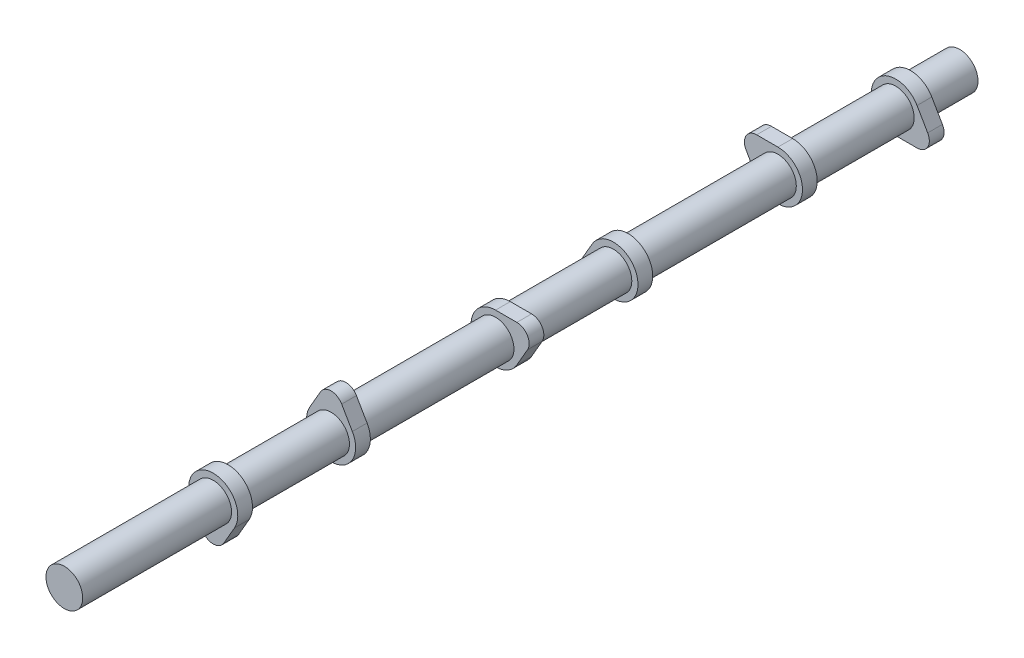
ISO-10303-21;
HEADER;
FILE_DESCRIPTION(('STEP AP214'),'2;1');
FILE_NAME('part.step','',(''),(''),'','','');
FILE_SCHEMA(('AUTOMOTIVE_DESIGN { 1 0 10303 214 1 1 1 1 }'));
ENDSEC;
DATA;
#1=APPLICATION_CONTEXT('core data for automotive mechanical design processes');
#2=APPLICATION_PROTOCOL_DEFINITION('international standard','automotive_design',2000,#1);
#3=PRODUCT_CONTEXT('',#1,'mechanical');
#4=PRODUCT('Part','Part','',(#3));
#5=PRODUCT_RELATED_PRODUCT_CATEGORY('part','',(#4));
#6=PRODUCT_DEFINITION_FORMATION('','',#4);
#7=PRODUCT_DEFINITION_CONTEXT('part definition',#1,'design');
#8=PRODUCT_DEFINITION('design','',#6,#7);
#9=PRODUCT_DEFINITION_SHAPE('','',#8);
#10=(LENGTH_UNIT() NAMED_UNIT(*) SI_UNIT(.MILLI.,.METRE.));
#11=(NAMED_UNIT(*) PLANE_ANGLE_UNIT() SI_UNIT($,.RADIAN.));
#12=(NAMED_UNIT(*) SI_UNIT($,.STERADIAN.) SOLID_ANGLE_UNIT());
#13=UNCERTAINTY_MEASURE_WITH_UNIT(LENGTH_MEASURE(1.E-05),#10,'distance_accuracy_value','');
#14=(GEOMETRIC_REPRESENTATION_CONTEXT(3) GLOBAL_UNCERTAINTY_ASSIGNED_CONTEXT((#13)) GLOBAL_UNIT_ASSIGNED_CONTEXT((#10,
#11,#12)) REPRESENTATION_CONTEXT('',''));
#15=CARTESIAN_POINT('',(0.,0.,0.));
#16=DIRECTION('',(0.,0.,1.));
#17=DIRECTION('',(1.,0.,0.));
#18=AXIS2_PLACEMENT_3D('',#15,#16,#17);
#19=CARTESIAN_POINT('',(0.,-12.7,68.58));
#20=DIRECTION('',(0.,0.,-1.));
#21=DIRECTION('',(1.,0.,0.));
#22=AXIS2_PLACEMENT_3D('',#19,#20,#21);
#23=CYLINDRICAL_SURFACE('',#22,6.35);
#24=CARTESIAN_POINT('',(0.,-12.7,60.96));
#25=DIRECTION('',(0.,0.,1.));
#26=DIRECTION('',(-1.,0.,0.));
#27=AXIS2_PLACEMENT_3D('',#24,#25,#26);
#28=CIRCLE('',#27,6.35);
#29=CARTESIAN_POINT('',(-5.4992613140313,-15.875,60.96));
#30=VERTEX_POINT('',#29);
#31=CARTESIAN_POINT('',(5.49926131403108,-15.875,60.96));
#32=VERTEX_POINT('',#31);
#33=EDGE_CURVE('E464',#30,#32,#28,.T.);
#34=ORIENTED_EDGE('',*,*,#33,.T.);
#35=DIRECTION('',(0.,0.,-1.));
#36=VECTOR('',#35,1.);
#37=CARTESIAN_POINT('',(5.49926131403108,-15.875,68.58));
#38=LINE('',#37,#36);
#39=CARTESIAN_POINT('',(5.49926131403108,-15.875,68.58));
#40=VERTEX_POINT('',#39);
#41=EDGE_CURVE('E494',#40,#32,#38,.T.);
#42=ORIENTED_EDGE('',*,*,#41,.F.);
#43=CARTESIAN_POINT('',(0.,-12.7,68.58));
#44=DIRECTION('',(0.,0.,1.));
#45=DIRECTION('',(-1.,0.,0.));
#46=AXIS2_PLACEMENT_3D('',#43,#44,#45);
#47=CIRCLE('',#46,6.35);
#48=CARTESIAN_POINT('',(-5.4992613140313,-15.875,68.58));
#49=VERTEX_POINT('',#48);
#50=EDGE_CURVE('E465',#49,#40,#47,.T.);
#51=ORIENTED_EDGE('',*,*,#50,.F.);
#52=DIRECTION('',(0.,0.,-1.));
#53=VECTOR('',#52,1.);
#54=CARTESIAN_POINT('',(-5.4992613140313,-15.875,68.58));
#55=LINE('',#54,#53);
#56=EDGE_CURVE('E475',#49,#30,#55,.T.);
#57=ORIENTED_EDGE('',*,*,#56,.T.);
#58=EDGE_LOOP('',(#34,#42,#51,#57));
#59=FACE_BOUND('',#58,.T.);
#60=ADVANCED_FACE('F45',(#59),#23,.T.);
#61=CARTESIAN_POINT('',(5.49926131403108,-15.875,68.58));
#62=DIRECTION('',(-0.866025403784435,0.500000000000006,0.));
#63=DIRECTION('',(-0.500000000000006,-0.866025403784435,0.));
#64=AXIS2_PLACEMENT_3D('',#61,#62,#63);
#65=PLANE('',#64);
#66=DIRECTION('',(0.500000000000006,0.866025403784435,0.));
#67=VECTOR('',#66,1.);
#68=CARTESIAN_POINT('',(5.49926131403108,-15.875,60.96));
#69=LINE('',#68,#67);
#70=CARTESIAN_POINT('',(10.9985226280623,-6.35000000000007,60.96));
#71=VERTEX_POINT('',#70);
#72=EDGE_CURVE('E479',#32,#71,#69,.T.);
#73=ORIENTED_EDGE('',*,*,#72,.T.);
#74=DIRECTION('',(0.,0.,-1.));
#75=VECTOR('',#74,1.);
#76=CARTESIAN_POINT('',(10.9985226280623,-6.35000000000007,68.58));
#77=LINE('',#76,#75);
#78=CARTESIAN_POINT('',(10.9985226280623,-6.35000000000007,68.58));
#79=VERTEX_POINT('',#78);
#80=EDGE_CURVE('E491',#79,#71,#77,.T.);
#81=ORIENTED_EDGE('',*,*,#80,.F.);
#82=DIRECTION('',(0.500000000000006,0.866025403784435,0.));
#83=VECTOR('',#82,1.);
#84=CARTESIAN_POINT('',(5.49926131403108,-15.875,68.58));
#85=LINE('',#84,#83);
#86=EDGE_CURVE('E95',#40,#79,#85,.T.);
#87=ORIENTED_EDGE('',*,*,#86,.F.);
#88=ORIENTED_EDGE('',*,*,#41,.T.);
#89=EDGE_LOOP('',(#73,#81,#87,#88));
#90=FACE_BOUND('',#89,.T.);
#91=ADVANCED_FACE('F515',(#90),#65,.F.);
#92=CARTESIAN_POINT('',(0.,0.,68.58));
#93=DIRECTION('',(0.,0.,-1.));
#94=DIRECTION('',(1.,0.,0.));
#95=AXIS2_PLACEMENT_3D('',#92,#93,#94);
#96=CYLINDRICAL_SURFACE('',#95,12.7);
#97=CARTESIAN_POINT('',(0.,0.,60.96));
#98=DIRECTION('',(0.,0.,1.));
#99=DIRECTION('',(-1.,0.,0.));
#100=AXIS2_PLACEMENT_3D('',#97,#98,#99);
#101=CIRCLE('',#100,12.7);
#102=CARTESIAN_POINT('',(-10.9985226280624,-6.34999999999993,60.96));
#103=VERTEX_POINT('',#102);
#104=EDGE_CURVE('E81',#71,#103,#101,.T.);
#105=ORIENTED_EDGE('',*,*,#104,.T.);
#106=DIRECTION('',(0.,0.,-1.));
#107=VECTOR('',#106,1.);
#108=CARTESIAN_POINT('',(-10.9985226280624,-6.34999999999993,68.58));
#109=LINE('',#108,#107);
#110=CARTESIAN_POINT('',(-10.9985226280624,-6.34999999999993,68.58));
#111=VERTEX_POINT('',#110);
#112=EDGE_CURVE('E488',#111,#103,#109,.T.);
#113=ORIENTED_EDGE('',*,*,#112,.F.);
#114=CARTESIAN_POINT('',(0.,0.,68.58));
#115=DIRECTION('',(0.,0.,1.));
#116=DIRECTION('',(-1.,0.,0.));
#117=AXIS2_PLACEMENT_3D('',#114,#115,#116);
#118=CIRCLE('',#117,12.7);
#119=EDGE_CURVE('E470',#79,#111,#118,.T.);
#120=ORIENTED_EDGE('',*,*,#119,.F.);
#121=ORIENTED_EDGE('',*,*,#80,.T.);
#122=EDGE_LOOP('',(#105,#113,#120,#121));
#123=FACE_BOUND('',#122,.T.);
#124=ADVANCED_FACE('F514',(#123),#96,.T.);
#125=CARTESIAN_POINT('',(-5.4992613140313,-15.875,68.58));
#126=DIRECTION('',(0.866025403784442,0.499999999999994,0.));
#127=DIRECTION('',(-0.499999999999994,0.866025403784442,0.));
#128=AXIS2_PLACEMENT_3D('',#125,#126,#127);
#129=PLANE('',#128);
#130=DIRECTION('',(0.499999999999994,-0.866025403784442,0.));
#131=VECTOR('',#130,1.);
#132=CARTESIAN_POINT('',(-5.4992613140313,-15.875,60.96));
#133=LINE('',#132,#131);
#134=EDGE_CURVE('E87',#103,#30,#133,.T.);
#135=ORIENTED_EDGE('',*,*,#134,.T.);
#136=ORIENTED_EDGE('',*,*,#56,.F.);
#137=DIRECTION('',(0.499999999999994,-0.866025403784442,0.));
#138=VECTOR('',#137,1.);
#139=CARTESIAN_POINT('',(-5.4992613140313,-15.875,68.58));
#140=LINE('',#139,#138);
#141=EDGE_CURVE('E63',#111,#49,#140,.T.);
#142=ORIENTED_EDGE('',*,*,#141,.F.);
#143=ORIENTED_EDGE('',*,*,#112,.T.);
#144=EDGE_LOOP('',(#135,#136,#142,#143));
#145=FACE_BOUND('',#144,.T.);
#146=ADVANCED_FACE('F512',(#145),#129,.F.);
#147=CARTESIAN_POINT('',(0.,-12.7,68.58));
#148=DIRECTION('',(0.,0.,1.));
#149=DIRECTION('',(-1.,0.,0.));
#150=AXIS2_PLACEMENT_3D('',#147,#148,#149);
#151=PLANE('',#150);
#152=CARTESIAN_POINT('',(0.,0.,68.58));
#153=DIRECTION('',(0.,0.,1.));
#154=DIRECTION('',(1.,0.,0.));
#155=AXIS2_PLACEMENT_3D('',#152,#153,#154);
#156=CIRCLE('',#155,9.5);
#157=CARTESIAN_POINT('',(9.5,0.,68.58));
#158=VERTEX_POINT('',#157);
#159=EDGE_CURVE('E460',#158,#158,#156,.F.);
#160=ORIENTED_EDGE('',*,*,#159,.T.);
#161=EDGE_LOOP('',(#160));
#162=FACE_BOUND('',#161,.T.);
#163=ORIENTED_EDGE('',*,*,#50,.T.);
#164=ORIENTED_EDGE('',*,*,#86,.T.);
#165=ORIENTED_EDGE('',*,*,#119,.T.);
#166=ORIENTED_EDGE('',*,*,#141,.T.);
#167=EDGE_LOOP('',(#163,#164,#165,#166));
#168=FACE_BOUND('',#167,.T.);
#169=ADVANCED_FACE('F506',(#162,#168),#151,.T.);
#170=CARTESIAN_POINT('',(0.,-12.7,60.96));
#171=DIRECTION('',(0.,0.,1.));
#172=DIRECTION('',(-1.,0.,0.));
#173=AXIS2_PLACEMENT_3D('',#170,#171,#172);
#174=PLANE('',#173);
#175=CARTESIAN_POINT('',(0.,0.,60.96));
#176=DIRECTION('',(0.,0.,1.));
#177=DIRECTION('',(1.,0.,0.));
#178=AXIS2_PLACEMENT_3D('',#175,#176,#177);
#179=CIRCLE('',#178,9.5);
#180=CARTESIAN_POINT('',(9.5,0.,60.96));
#181=VERTEX_POINT('',#180);
#182=EDGE_CURVE('E55',#181,#181,#179,.F.);
#183=ORIENTED_EDGE('',*,*,#182,.F.);
#184=EDGE_LOOP('',(#183));
#185=FACE_BOUND('',#184,.T.);
#186=ORIENTED_EDGE('',*,*,#33,.F.);
#187=ORIENTED_EDGE('',*,*,#134,.F.);
#188=ORIENTED_EDGE('',*,*,#104,.F.);
#189=ORIENTED_EDGE('',*,*,#72,.F.);
#190=EDGE_LOOP('',(#186,#187,#188,#189));
#191=FACE_BOUND('',#190,.T.);
#192=ADVANCED_FACE('F503',(#185,#191),#174,.F.);
#193=CARTESIAN_POINT('',(0.,0.,120.65));
#194=DIRECTION('',(0.,0.,-1.));
#195=DIRECTION('',(-1.,0.,0.));
#196=AXIS2_PLACEMENT_3D('',#193,#194,#195);
#197=CYLINDRICAL_SURFACE('',#196,9.5);
#198=CARTESIAN_POINT('',(0.,0.,7.62));
#199=DIRECTION('',(0.,0.,1.));
#200=DIRECTION('',(1.,0.,0.));
#201=AXIS2_PLACEMENT_3D('',#198,#199,#200);
#202=CIRCLE('',#201,9.5);
#203=CARTESIAN_POINT('',(9.5,0.,7.62));
#204=VERTEX_POINT('',#203);
#205=EDGE_CURVE('E48',#204,#204,#202,.T.);
#206=ORIENTED_EDGE('',*,*,#205,.T.);
#207=EDGE_LOOP('',(#206));
#208=FACE_BOUND('',#207,.T.);
#209=ORIENTED_EDGE('',*,*,#182,.T.);
#210=EDGE_LOOP('',(#209));
#211=FACE_BOUND('',#210,.T.);
#212=ADVANCED_FACE('F501',(#208,#211),#197,.T.);
#213=ORIENTED_EDGE('',*,*,#159,.F.);
#214=EDGE_LOOP('',(#213));
#215=FACE_BOUND('',#214,.T.);
#216=CARTESIAN_POINT('',(0.,0.,145.59));
#217=DIRECTION('',(0.,0.,1.));
#218=DIRECTION('',(1.,0.,0.));
#219=AXIS2_PLACEMENT_3D('',#216,#217,#218);
#220=CIRCLE('',#219,9.5);
#221=CARTESIAN_POINT('',(9.5,0.,145.59));
#222=VERTEX_POINT('',#221);
#223=EDGE_CURVE('E411',#222,#222,#220,.T.);
#224=ORIENTED_EDGE('',*,*,#223,.F.);
#225=EDGE_LOOP('',(#224));
#226=FACE_BOUND('',#225,.T.);
#227=ADVANCED_FACE('F528',(#215,#226),#197,.T.);
#228=CARTESIAN_POINT('',(0.,12.7,7.62));
#229=DIRECTION('',(0.,0.,-1.));
#230=DIRECTION('',(-1.,0.,0.));
#231=AXIS2_PLACEMENT_3D('',#228,#229,#230);
#232=CYLINDRICAL_SURFACE('',#231,6.35);
#233=CARTESIAN_POINT('',(0.,12.7,0.));
#234=DIRECTION('',(0.,0.,1.));
#235=DIRECTION('',(1.,0.,0.));
#236=AXIS2_PLACEMENT_3D('',#233,#234,#235);
#237=CIRCLE('',#236,6.35);
#238=CARTESIAN_POINT('',(5.49926131403119,15.875,0.));
#239=VERTEX_POINT('',#238);
#240=CARTESIAN_POINT('',(-5.49926131403119,15.875,0.));
#241=VERTEX_POINT('',#240);
#242=EDGE_CURVE('E418',#239,#241,#237,.T.);
#243=ORIENTED_EDGE('',*,*,#242,.T.);
#244=DIRECTION('',(0.,0.,-1.));
#245=VECTOR('',#244,1.);
#246=CARTESIAN_POINT('',(-5.49926131403119,15.875,7.62));
#247=LINE('',#246,#245);
#248=CARTESIAN_POINT('',(-5.49926131403119,15.875,7.62));
#249=VERTEX_POINT('',#248);
#250=EDGE_CURVE('E456',#249,#241,#247,.T.);
#251=ORIENTED_EDGE('',*,*,#250,.F.);
#252=CARTESIAN_POINT('',(0.,12.7,7.62));
#253=DIRECTION('',(0.,0.,1.));
#254=DIRECTION('',(1.,0.,0.));
#255=AXIS2_PLACEMENT_3D('',#252,#253,#254);
#256=CIRCLE('',#255,6.35);
#257=CARTESIAN_POINT('',(5.49926131403119,15.875,7.62));
#258=VERTEX_POINT('',#257);
#259=EDGE_CURVE('E419',#258,#249,#256,.T.);
#260=ORIENTED_EDGE('',*,*,#259,.F.);
#261=DIRECTION('',(0.,0.,-1.));
#262=VECTOR('',#261,1.);
#263=CARTESIAN_POINT('',(5.49926131403119,15.875,7.62));
#264=LINE('',#263,#262);
#265=EDGE_CURVE('E433',#258,#239,#264,.T.);
#266=ORIENTED_EDGE('',*,*,#265,.T.);
#267=EDGE_LOOP('',(#243,#251,#260,#266));
#268=FACE_BOUND('',#267,.T.);
#269=ADVANCED_FACE('F531',(#268),#232,.T.);
#270=CARTESIAN_POINT('',(-5.49926131403119,15.875,7.62));
#271=DIRECTION('',(0.866025403784439,-0.5,0.));
#272=DIRECTION('',(0.5,0.866025403784439,0.));
#273=AXIS2_PLACEMENT_3D('',#270,#271,#272);
#274=PLANE('',#273);
#275=DIRECTION('',(-0.5,-0.866025403784439,0.));
#276=VECTOR('',#275,1.);
#277=CARTESIAN_POINT('',(-5.49926131403119,15.875,0.));
#278=LINE('',#277,#276);
#279=CARTESIAN_POINT('',(-10.9985226280624,6.35,0.));
#280=VERTEX_POINT('',#279);
#281=EDGE_CURVE('E437',#241,#280,#278,.T.);
#282=ORIENTED_EDGE('',*,*,#281,.T.);
#283=DIRECTION('',(0.,0.,-1.));
#284=VECTOR('',#283,1.);
#285=CARTESIAN_POINT('',(-10.9985226280624,6.35,7.62));
#286=LINE('',#285,#284);
#287=CARTESIAN_POINT('',(-10.9985226280624,6.35,7.62));
#288=VERTEX_POINT('',#287);
#289=EDGE_CURVE('E452',#288,#280,#286,.T.);
#290=ORIENTED_EDGE('',*,*,#289,.F.);
#291=DIRECTION('',(-0.5,-0.866025403784439,0.));
#292=VECTOR('',#291,1.);
#293=CARTESIAN_POINT('',(-5.49926131403119,15.875,7.62));
#294=LINE('',#293,#292);
#295=EDGE_CURVE('E423',#249,#288,#294,.T.);
#296=ORIENTED_EDGE('',*,*,#295,.F.);
#297=ORIENTED_EDGE('',*,*,#250,.T.);
#298=EDGE_LOOP('',(#282,#290,#296,#297));
#299=FACE_BOUND('',#298,.T.);
#300=ADVANCED_FACE('F536',(#299),#274,.F.);
#301=CARTESIAN_POINT('',(0.,0.,7.62));
#302=DIRECTION('',(0.,0.,-1.));
#303=DIRECTION('',(-1.,0.,0.));
#304=AXIS2_PLACEMENT_3D('',#301,#302,#303);
#305=CYLINDRICAL_SURFACE('',#304,12.7);
#306=CARTESIAN_POINT('',(0.,0.,0.));
#307=DIRECTION('',(0.,0.,1.));
#308=DIRECTION('',(1.,0.,0.));
#309=AXIS2_PLACEMENT_3D('',#306,#307,#308);
#310=CIRCLE('',#309,12.7);
#311=CARTESIAN_POINT('',(10.9985226280624,6.35,0.));
#312=VERTEX_POINT('',#311);
#313=EDGE_CURVE('E440',#280,#312,#310,.T.);
#314=ORIENTED_EDGE('',*,*,#313,.T.);
#315=DIRECTION('',(0.,0.,-1.));
#316=VECTOR('',#315,1.);
#317=CARTESIAN_POINT('',(10.9985226280624,6.35,7.62));
#318=LINE('',#317,#316);
#319=CARTESIAN_POINT('',(10.9985226280624,6.35,7.62));
#320=VERTEX_POINT('',#319);
#321=EDGE_CURVE('E448',#320,#312,#318,.T.);
#322=ORIENTED_EDGE('',*,*,#321,.F.);
#323=CARTESIAN_POINT('',(0.,0.,7.62));
#324=DIRECTION('',(0.,0.,1.));
#325=DIRECTION('',(1.,0.,0.));
#326=AXIS2_PLACEMENT_3D('',#323,#324,#325);
#327=CIRCLE('',#326,12.7);
#328=EDGE_CURVE('E427',#288,#320,#327,.T.);
#329=ORIENTED_EDGE('',*,*,#328,.F.);
#330=ORIENTED_EDGE('',*,*,#289,.T.);
#331=EDGE_LOOP('',(#314,#322,#329,#330));
#332=FACE_BOUND('',#331,.T.);
#333=ADVANCED_FACE('F540',(#332),#305,.T.);
#334=CARTESIAN_POINT('',(5.49926131403119,15.875,7.62));
#335=DIRECTION('',(-0.866025403784439,-0.5,0.));
#336=DIRECTION('',(0.5,-0.866025403784439,0.));
#337=AXIS2_PLACEMENT_3D('',#334,#335,#336);
#338=PLANE('',#337);
#339=DIRECTION('',(-0.5,0.866025403784439,0.));
#340=VECTOR('',#339,1.);
#341=CARTESIAN_POINT('',(5.49926131403119,15.875,0.));
#342=LINE('',#341,#340);
#343=EDGE_CURVE('E424',#312,#239,#342,.T.);
#344=ORIENTED_EDGE('',*,*,#343,.T.);
#345=ORIENTED_EDGE('',*,*,#265,.F.);
#346=DIRECTION('',(-0.5,0.866025403784439,0.));
#347=VECTOR('',#346,1.);
#348=CARTESIAN_POINT('',(5.49926131403119,15.875,7.62));
#349=LINE('',#348,#347);
#350=EDGE_CURVE('E430',#320,#258,#349,.T.);
#351=ORIENTED_EDGE('',*,*,#350,.F.);
#352=ORIENTED_EDGE('',*,*,#321,.T.);
#353=EDGE_LOOP('',(#344,#345,#351,#352));
#354=FACE_BOUND('',#353,.T.);
#355=ADVANCED_FACE('F544',(#354),#338,.F.);
#356=CARTESIAN_POINT('',(0.,12.7,7.62));
#357=DIRECTION('',(0.,0.,1.));
#358=DIRECTION('',(1.,0.,0.));
#359=AXIS2_PLACEMENT_3D('',#356,#357,#358);
#360=PLANE('',#359);
#361=ORIENTED_EDGE('',*,*,#205,.F.);
#362=EDGE_LOOP('',(#361));
#363=FACE_BOUND('',#362,.T.);
#364=ORIENTED_EDGE('',*,*,#259,.T.);
#365=ORIENTED_EDGE('',*,*,#295,.T.);
#366=ORIENTED_EDGE('',*,*,#328,.T.);
#367=ORIENTED_EDGE('',*,*,#350,.T.);
#368=EDGE_LOOP('',(#364,#365,#366,#367));
#369=FACE_BOUND('',#368,.T.);
#370=ADVANCED_FACE('F548',(#363,#369),#360,.T.);
#371=CARTESIAN_POINT('',(0.,12.7,0.));
#372=DIRECTION('',(0.,0.,1.));
#373=DIRECTION('',(1.,0.,0.));
#374=AXIS2_PLACEMENT_3D('',#371,#372,#373);
#375=PLANE('',#374);
#376=CARTESIAN_POINT('',(0.,0.,0.));
#377=DIRECTION('',(0.,0.,1.));
#378=DIRECTION('',(1.,0.,0.));
#379=AXIS2_PLACEMENT_3D('',#376,#377,#378);
#380=CIRCLE('',#379,9.5);
#381=CARTESIAN_POINT('',(9.5,0.,0.));
#382=VERTEX_POINT('',#381);
#383=EDGE_CURVE('E11',#382,#382,#380,.T.);
#384=ORIENTED_EDGE('',*,*,#383,.T.);
#385=EDGE_LOOP('',(#384));
#386=FACE_BOUND('',#385,.T.);
#387=ORIENTED_EDGE('',*,*,#242,.F.);
#388=ORIENTED_EDGE('',*,*,#343,.F.);
#389=ORIENTED_EDGE('',*,*,#313,.F.);
#390=ORIENTED_EDGE('',*,*,#281,.F.);
#391=EDGE_LOOP('',(#387,#388,#389,#390));
#392=FACE_BOUND('',#391,.T.);
#393=ADVANCED_FACE('F550',(#386,#392),#375,.F.);
#394=ORIENTED_EDGE('',*,*,#383,.F.);
#395=EDGE_LOOP('',(#394));
#396=FACE_BOUND('',#395,.T.);
#397=CARTESIAN_POINT('',(0.,0.,-77.47));
#398=DIRECTION('',(0.,0.,1.));
#399=DIRECTION('',(-0.500000000000004,0.866025403784436,0.));
#400=AXIS2_PLACEMENT_3D('',#397,#398,#399);
#401=CIRCLE('',#400,9.5);
#402=CARTESIAN_POINT('',(-4.75000000000004,8.22724133595215,-77.47));
#403=VERTEX_POINT('',#402);
#404=EDGE_CURVE('E357',#403,#403,#401,.F.);
#405=ORIENTED_EDGE('',*,*,#404,.F.);
#406=EDGE_LOOP('',(#405));
#407=FACE_BOUND('',#406,.T.);
#408=ADVANCED_FACE('F533',(#396,#407),#197,.T.);
#409=CARTESIAN_POINT('',(0.,0.,145.59));
#410=DIRECTION('',(0.,0.,1.));
#411=DIRECTION('',(1.,0.,0.));
#412=AXIS2_PLACEMENT_3D('',#409,#410,#411);
#413=PLANE('',#412);
#414=ORIENTED_EDGE('',*,*,#223,.T.);
#415=EDGE_LOOP('',(#414));
#416=FACE_BOUND('',#415,.T.);
#417=ADVANCED_FACE('F557',(#416),#413,.T.);
#418=CARTESIAN_POINT('',(10.9985226280624,6.34999999999998,-77.47));
#419=DIRECTION('',(0.,0.,-1.));
#420=DIRECTION('',(-0.499999999999998,0.86602540378444,0.));
#421=AXIS2_PLACEMENT_3D('',#418,#419,#420);
#422=CYLINDRICAL_SURFACE('',#421,6.35);
#423=CARTESIAN_POINT('',(10.9985226280624,6.34999999999998,-85.09));
#424=DIRECTION('',(0.,0.,1.));
#425=DIRECTION('',(0.499999999999998,-0.86602540378444,0.));
#426=AXIS2_PLACEMENT_3D('',#423,#424,#425);
#427=CIRCLE('',#426,6.35);
#428=CARTESIAN_POINT('',(16.4977839420936,3.17499999999996,-85.09));
#429=VERTEX_POINT('',#428);
#430=CARTESIAN_POINT('',(10.9985226280624,12.7,-85.09));
#431=VERTEX_POINT('',#430);
#432=EDGE_CURVE('E361',#429,#431,#427,.T.);
#433=ORIENTED_EDGE('',*,*,#432,.T.);
#434=DIRECTION('',(0.,0.,-1.));
#435=VECTOR('',#434,1.);
#436=CARTESIAN_POINT('',(10.9985226280624,12.7,-77.47));
#437=LINE('',#436,#435);
#438=CARTESIAN_POINT('',(10.9985226280624,12.7,-77.47));
#439=VERTEX_POINT('',#438);
#440=EDGE_CURVE('E399',#439,#431,#437,.T.);
#441=ORIENTED_EDGE('',*,*,#440,.F.);
#442=CARTESIAN_POINT('',(10.9985226280624,6.34999999999998,-77.47));
#443=DIRECTION('',(0.,0.,1.));
#444=DIRECTION('',(0.499999999999998,-0.86602540378444,0.));
#445=AXIS2_PLACEMENT_3D('',#442,#443,#444);
#446=CIRCLE('',#445,6.35);
#447=CARTESIAN_POINT('',(16.4977839420936,3.17499999999996,-77.47));
#448=VERTEX_POINT('',#447);
#449=EDGE_CURVE('E362',#448,#439,#446,.T.);
#450=ORIENTED_EDGE('',*,*,#449,.F.);
#451=DIRECTION('',(0.,0.,-1.));
#452=VECTOR('',#451,1.);
#453=CARTESIAN_POINT('',(16.4977839420936,3.17499999999996,-77.47));
#454=LINE('',#453,#452);
#455=EDGE_CURVE('E376',#448,#429,#454,.T.);
#456=ORIENTED_EDGE('',*,*,#455,.T.);
#457=EDGE_LOOP('',(#433,#441,#450,#456));
#458=FACE_BOUND('',#457,.T.);
#459=ADVANCED_FACE('F560',(#458),#422,.T.);
#460=CARTESIAN_POINT('',(10.9985226280624,12.7,-77.47));
#461=DIRECTION('',(0.,-1.,0.));
#462=DIRECTION('',(1.,0.,0.));
#463=AXIS2_PLACEMENT_3D('',#460,#461,#462);
#464=PLANE('',#463);
#465=DIRECTION('',(-1.,0.,0.));
#466=VECTOR('',#465,1.);
#467=CARTESIAN_POINT('',(10.9985226280624,12.7,-85.09));
#468=LINE('',#467,#466);
#469=CARTESIAN_POINT('',(0.,12.7,-85.09));
#470=VERTEX_POINT('',#469);
#471=EDGE_CURVE('E380',#431,#470,#468,.T.);
#472=ORIENTED_EDGE('',*,*,#471,.T.);
#473=DIRECTION('',(0.,0.,-1.));
#474=VECTOR('',#473,1.);
#475=CARTESIAN_POINT('',(0.,12.7,-77.47));
#476=LINE('',#475,#474);
#477=CARTESIAN_POINT('',(0.,12.7,-77.47));
#478=VERTEX_POINT('',#477);
#479=EDGE_CURVE('E395',#478,#470,#476,.T.);
#480=ORIENTED_EDGE('',*,*,#479,.F.);
#481=DIRECTION('',(-1.,0.,0.));
#482=VECTOR('',#481,1.);
#483=CARTESIAN_POINT('',(10.9985226280624,12.7,-77.47));
#484=LINE('',#483,#482);
#485=EDGE_CURVE('E366',#439,#478,#484,.T.);
#486=ORIENTED_EDGE('',*,*,#485,.F.);
#487=ORIENTED_EDGE('',*,*,#440,.T.);
#488=EDGE_LOOP('',(#472,#480,#486,#487));
#489=FACE_BOUND('',#488,.T.);
#490=ADVANCED_FACE('F564',(#489),#464,.F.);
#491=CARTESIAN_POINT('',(0.,0.,-77.47));
#492=DIRECTION('',(0.,0.,-1.));
#493=DIRECTION('',(-0.499999999999998,0.86602540378444,0.));
#494=AXIS2_PLACEMENT_3D('',#491,#492,#493);
#495=CYLINDRICAL_SURFACE('',#494,12.7);
#496=CARTESIAN_POINT('',(0.,0.,-85.09));
#497=DIRECTION('',(0.,0.,1.));
#498=DIRECTION('',(0.499999999999998,-0.86602540378444,0.));
#499=AXIS2_PLACEMENT_3D('',#496,#497,#498);
#500=CIRCLE('',#499,12.7);
#501=CARTESIAN_POINT('',(10.9985226280624,-6.35000000000002,-85.09));
#502=VERTEX_POINT('',#501);
#503=EDGE_CURVE('E383',#470,#502,#500,.T.);
#504=ORIENTED_EDGE('',*,*,#503,.T.);
#505=DIRECTION('',(0.,0.,-1.));
#506=VECTOR('',#505,1.);
#507=CARTESIAN_POINT('',(10.9985226280624,-6.35000000000002,-77.47));
#508=LINE('',#507,#506);
#509=CARTESIAN_POINT('',(10.9985226280624,-6.35000000000002,-77.47));
#510=VERTEX_POINT('',#509);
#511=EDGE_CURVE('E391',#510,#502,#508,.T.);
#512=ORIENTED_EDGE('',*,*,#511,.F.);
#513=CARTESIAN_POINT('',(0.,0.,-77.47));
#514=DIRECTION('',(0.,0.,1.));
#515=DIRECTION('',(0.499999999999998,-0.86602540378444,0.));
#516=AXIS2_PLACEMENT_3D('',#513,#514,#515);
#517=CIRCLE('',#516,12.7);
#518=EDGE_CURVE('E370',#478,#510,#517,.T.);
#519=ORIENTED_EDGE('',*,*,#518,.F.);
#520=ORIENTED_EDGE('',*,*,#479,.T.);
#521=EDGE_LOOP('',(#504,#512,#519,#520));
#522=FACE_BOUND('',#521,.T.);
#523=ADVANCED_FACE('F568',(#522),#495,.T.);
#524=CARTESIAN_POINT('',(16.4977839420936,3.17499999999996,-77.47));
#525=DIRECTION('',(-0.866025403784437,0.500000000000002,0.));
#526=DIRECTION('',(-0.500000000000002,-0.866025403784437,0.));
#527=AXIS2_PLACEMENT_3D('',#524,#525,#526);
#528=PLANE('',#527);
#529=DIRECTION('',(0.500000000000002,0.866025403784437,0.));
#530=VECTOR('',#529,1.);
#531=CARTESIAN_POINT('',(16.4977839420936,3.17499999999996,-85.09));
#532=LINE('',#531,#530);
#533=EDGE_CURVE('E367',#502,#429,#532,.T.);
#534=ORIENTED_EDGE('',*,*,#533,.T.);
#535=ORIENTED_EDGE('',*,*,#455,.F.);
#536=DIRECTION('',(0.500000000000002,0.866025403784437,0.));
#537=VECTOR('',#536,1.);
#538=CARTESIAN_POINT('',(16.4977839420936,3.17499999999996,-77.47));
#539=LINE('',#538,#537);
#540=EDGE_CURVE('E373',#510,#448,#539,.T.);
#541=ORIENTED_EDGE('',*,*,#540,.F.);
#542=ORIENTED_EDGE('',*,*,#511,.T.);
#543=EDGE_LOOP('',(#534,#535,#541,#542));
#544=FACE_BOUND('',#543,.T.);
#545=ADVANCED_FACE('F572',(#544),#528,.F.);
#546=CARTESIAN_POINT('',(10.9985226280624,6.34999999999998,-77.47));
#547=DIRECTION('',(0.,0.,1.));
#548=DIRECTION('',(0.499999999999998,-0.86602540378444,0.));
#549=AXIS2_PLACEMENT_3D('',#546,#547,#548);
#550=PLANE('',#549);
#551=ORIENTED_EDGE('',*,*,#404,.T.);
#552=EDGE_LOOP('',(#551));
#553=FACE_BOUND('',#552,.T.);
#554=ORIENTED_EDGE('',*,*,#449,.T.);
#555=ORIENTED_EDGE('',*,*,#485,.T.);
#556=ORIENTED_EDGE('',*,*,#518,.T.);
#557=ORIENTED_EDGE('',*,*,#540,.T.);
#558=EDGE_LOOP('',(#554,#555,#556,#557));
#559=FACE_BOUND('',#558,.T.);
#560=ADVANCED_FACE('F576',(#553,#559),#550,.T.);
#561=CARTESIAN_POINT('',(10.9985226280624,6.34999999999998,-85.09));
#562=DIRECTION('',(0.,0.,1.));
#563=DIRECTION('',(0.499999999999998,-0.86602540378444,0.));
#564=AXIS2_PLACEMENT_3D('',#561,#562,#563);
#565=PLANE('',#564);
#566=CARTESIAN_POINT('',(0.,0.,-85.09));
#567=DIRECTION('',(0.,0.,1.));
#568=DIRECTION('',(-0.500000000000004,0.866025403784436,0.));
#569=AXIS2_PLACEMENT_3D('',#566,#567,#568);
#570=CIRCLE('',#569,9.5);
#571=CARTESIAN_POINT('',(-4.75000000000004,8.22724133595215,-85.09));
#572=VERTEX_POINT('',#571);
#573=EDGE_CURVE('E403',#572,#572,#570,.F.);
#574=ORIENTED_EDGE('',*,*,#573,.F.);
#575=EDGE_LOOP('',(#574));
#576=FACE_BOUND('',#575,.T.);
#577=ORIENTED_EDGE('',*,*,#432,.F.);
#578=ORIENTED_EDGE('',*,*,#533,.F.);
#579=ORIENTED_EDGE('',*,*,#503,.F.);
#580=ORIENTED_EDGE('',*,*,#471,.F.);
#581=EDGE_LOOP('',(#577,#578,#579,#580));
#582=FACE_BOUND('',#581,.T.);
#583=ADVANCED_FACE('F578',(#576,#582),#565,.F.);
#584=CARTESIAN_POINT('',(0.,0.,-25.4));
#585=DIRECTION('',(0.,0.,-1.));
#586=DIRECTION('',(0.500000000000004,-0.866025403784436,0.));
#587=AXIS2_PLACEMENT_3D('',#584,#585,#586);
#588=CYLINDRICAL_SURFACE('',#587,9.5);
#589=CARTESIAN_POINT('',(0.,0.,-138.43));
#590=DIRECTION('',(0.,0.,1.));
#591=DIRECTION('',(-0.500000000000004,0.866025403784436,0.));
#592=AXIS2_PLACEMENT_3D('',#589,#590,#591);
#593=CIRCLE('',#592,9.5);
#594=CARTESIAN_POINT('',(-4.75000000000004,8.22724133595215,-138.43));
#595=VERTEX_POINT('',#594);
#596=EDGE_CURVE('E356',#595,#595,#593,.T.);
#597=ORIENTED_EDGE('',*,*,#596,.T.);
#598=EDGE_LOOP('',(#597));
#599=FACE_BOUND('',#598,.T.);
#600=ORIENTED_EDGE('',*,*,#573,.T.);
#601=EDGE_LOOP('',(#600));
#602=FACE_BOUND('',#601,.T.);
#603=ADVANCED_FACE('F581',(#599,#602),#588,.T.);
#604=CARTESIAN_POINT('',(-10.9985226280623,-6.35000000000005,-138.43));
#605=DIRECTION('',(0.,0.,-1.));
#606=DIRECTION('',(0.500000000000004,-0.866025403784436,0.));
#607=AXIS2_PLACEMENT_3D('',#604,#605,#606);
#608=CYLINDRICAL_SURFACE('',#607,6.35);
#609=CARTESIAN_POINT('',(-10.9985226280623,-6.35000000000005,-146.05));
#610=DIRECTION('',(0.,0.,1.));
#611=DIRECTION('',(-0.500000000000004,0.866025403784436,0.));
#612=AXIS2_PLACEMENT_3D('',#609,#610,#611);
#613=CIRCLE('',#612,6.35);
#614=CARTESIAN_POINT('',(-16.4977839420935,-3.17500000000008,-146.05));
#615=VERTEX_POINT('',#614);
#616=CARTESIAN_POINT('',(-10.9985226280623,-12.7000000000001,-146.05));
#617=VERTEX_POINT('',#616);
#618=EDGE_CURVE('E313',#615,#617,#613,.T.);
#619=ORIENTED_EDGE('',*,*,#618,.T.);
#620=DIRECTION('',(0.,0.,-1.));
#621=VECTOR('',#620,1.);
#622=CARTESIAN_POINT('',(-10.9985226280623,-12.7000000000001,-138.43));
#623=LINE('',#622,#621);
#624=CARTESIAN_POINT('',(-10.9985226280623,-12.7000000000001,-138.43));
#625=VERTEX_POINT('',#624);
#626=EDGE_CURVE('E352',#625,#617,#623,.T.);
#627=ORIENTED_EDGE('',*,*,#626,.F.);
#628=CARTESIAN_POINT('',(-10.9985226280623,-6.35000000000005,-138.43));
#629=DIRECTION('',(0.,0.,1.));
#630=DIRECTION('',(-0.500000000000004,0.866025403784436,0.));
#631=AXIS2_PLACEMENT_3D('',#628,#629,#630);
#632=CIRCLE('',#631,6.35);
#633=CARTESIAN_POINT('',(-16.4977839420935,-3.17500000000008,-138.43));
#634=VERTEX_POINT('',#633);
#635=EDGE_CURVE('E315',#634,#625,#632,.T.);
#636=ORIENTED_EDGE('',*,*,#635,.F.);
#637=DIRECTION('',(0.,0.,-1.));
#638=VECTOR('',#637,1.);
#639=CARTESIAN_POINT('',(-16.4977839420935,-3.17500000000008,-138.43));
#640=LINE('',#639,#638);
#641=EDGE_CURVE('E329',#634,#615,#640,.T.);
#642=ORIENTED_EDGE('',*,*,#641,.T.);
#643=EDGE_LOOP('',(#619,#627,#636,#642));
#644=FACE_BOUND('',#643,.T.);
#645=ADVANCED_FACE('F592',(#644),#608,.T.);
#646=CARTESIAN_POINT('',(-10.9985226280623,-12.7000000000001,-138.43));
#647=DIRECTION('',(0.,1.,0.));
#648=DIRECTION('',(-1.,0.,0.));
#649=AXIS2_PLACEMENT_3D('',#646,#647,#648);
#650=PLANE('',#649);
#651=DIRECTION('',(1.,0.,0.));
#652=VECTOR('',#651,1.);
#653=CARTESIAN_POINT('',(-10.9985226280623,-12.7000000000001,-146.05));
#654=LINE('',#653,#652);
#655=CARTESIAN_POINT('',(0.,-12.7,-146.05));
#656=VERTEX_POINT('',#655);
#657=EDGE_CURVE('E333',#617,#656,#654,.T.);
#658=ORIENTED_EDGE('',*,*,#657,.T.);
#659=DIRECTION('',(0.,0.,-1.));
#660=VECTOR('',#659,1.);
#661=CARTESIAN_POINT('',(0.,-12.7,-138.43));
#662=LINE('',#661,#660);
#663=CARTESIAN_POINT('',(0.,-12.7,-138.43));
#664=VERTEX_POINT('',#663);
#665=EDGE_CURVE('E348',#664,#656,#662,.T.);
#666=ORIENTED_EDGE('',*,*,#665,.F.);
#667=DIRECTION('',(1.,0.,0.));
#668=VECTOR('',#667,1.);
#669=CARTESIAN_POINT('',(-10.9985226280623,-12.7000000000001,-138.43));
#670=LINE('',#669,#668);
#671=EDGE_CURVE('E319',#625,#664,#670,.T.);
#672=ORIENTED_EDGE('',*,*,#671,.F.);
#673=ORIENTED_EDGE('',*,*,#626,.T.);
#674=EDGE_LOOP('',(#658,#666,#672,#673));
#675=FACE_BOUND('',#674,.T.);
#676=ADVANCED_FACE('F595',(#675),#650,.F.);
#677=CARTESIAN_POINT('',(0.,0.,-138.43));
#678=DIRECTION('',(0.,0.,-1.));
#679=DIRECTION('',(0.500000000000004,-0.866025403784436,0.));
#680=AXIS2_PLACEMENT_3D('',#677,#678,#679);
#681=CYLINDRICAL_SURFACE('',#680,12.7);
#682=CARTESIAN_POINT('',(0.,0.,-146.05));
#683=DIRECTION('',(0.,0.,1.));
#684=DIRECTION('',(-0.500000000000004,0.866025403784436,0.));
#685=AXIS2_PLACEMENT_3D('',#682,#683,#684);
#686=CIRCLE('',#685,12.7);
#687=CARTESIAN_POINT('',(-10.9985226280624,6.34999999999995,-146.05));
#688=VERTEX_POINT('',#687);
#689=EDGE_CURVE('E336',#656,#688,#686,.T.);
#690=ORIENTED_EDGE('',*,*,#689,.T.);
#691=DIRECTION('',(0.,0.,-1.));
#692=VECTOR('',#691,1.);
#693=CARTESIAN_POINT('',(-10.9985226280624,6.34999999999995,-138.43));
#694=LINE('',#693,#692);
#695=CARTESIAN_POINT('',(-10.9985226280624,6.34999999999995,-138.43));
#696=VERTEX_POINT('',#695);
#697=EDGE_CURVE('E344',#696,#688,#694,.T.);
#698=ORIENTED_EDGE('',*,*,#697,.F.);
#699=CARTESIAN_POINT('',(0.,0.,-138.43));
#700=DIRECTION('',(0.,0.,1.));
#701=DIRECTION('',(-0.500000000000004,0.866025403784436,0.));
#702=AXIS2_PLACEMENT_3D('',#699,#700,#701);
#703=CIRCLE('',#702,12.7);
#704=EDGE_CURVE('E323',#664,#696,#703,.T.);
#705=ORIENTED_EDGE('',*,*,#704,.F.);
#706=ORIENTED_EDGE('',*,*,#665,.T.);
#707=EDGE_LOOP('',(#690,#698,#705,#706));
#708=FACE_BOUND('',#707,.T.);
#709=ADVANCED_FACE('F599',(#708),#681,.T.);
#710=CARTESIAN_POINT('',(-16.4977839420935,-3.17500000000008,-138.43));
#711=DIRECTION('',(0.866025403784441,-0.499999999999996,0.));
#712=DIRECTION('',(0.499999999999996,0.866025403784441,0.));
#713=AXIS2_PLACEMENT_3D('',#710,#711,#712);
#714=PLANE('',#713);
#715=DIRECTION('',(-0.499999999999996,-0.866025403784441,0.));
#716=VECTOR('',#715,1.);
#717=CARTESIAN_POINT('',(-16.4977839420935,-3.17500000000008,-146.05));
#718=LINE('',#717,#716);
#719=EDGE_CURVE('E320',#688,#615,#718,.T.);
#720=ORIENTED_EDGE('',*,*,#719,.T.);
#721=ORIENTED_EDGE('',*,*,#641,.F.);
#722=DIRECTION('',(-0.499999999999996,-0.866025403784441,0.));
#723=VECTOR('',#722,1.);
#724=CARTESIAN_POINT('',(-16.4977839420935,-3.17500000000008,-138.43));
#725=LINE('',#724,#723);
#726=EDGE_CURVE('E326',#696,#634,#725,.T.);
#727=ORIENTED_EDGE('',*,*,#726,.F.);
#728=ORIENTED_EDGE('',*,*,#697,.T.);
#729=EDGE_LOOP('',(#720,#721,#727,#728));
#730=FACE_BOUND('',#729,.T.);
#731=ADVANCED_FACE('F603',(#730),#714,.F.);
#732=CARTESIAN_POINT('',(-10.9985226280623,-6.35000000000005,-138.43));
#733=DIRECTION('',(0.,0.,1.));
#734=DIRECTION('',(-0.500000000000004,0.866025403784436,0.));
#735=AXIS2_PLACEMENT_3D('',#732,#733,#734);
#736=PLANE('',#735);
#737=ORIENTED_EDGE('',*,*,#596,.F.);
#738=EDGE_LOOP('',(#737));
#739=FACE_BOUND('',#738,.T.);
#740=ORIENTED_EDGE('',*,*,#635,.T.);
#741=ORIENTED_EDGE('',*,*,#671,.T.);
#742=ORIENTED_EDGE('',*,*,#704,.T.);
#743=ORIENTED_EDGE('',*,*,#726,.T.);
#744=EDGE_LOOP('',(#740,#741,#742,#743));
#745=FACE_BOUND('',#744,.T.);
#746=ADVANCED_FACE('F607',(#739,#745),#736,.T.);
#747=CARTESIAN_POINT('',(-10.9985226280623,-6.35000000000005,-146.05));
#748=DIRECTION('',(0.,0.,1.));
#749=DIRECTION('',(-0.500000000000004,0.866025403784436,0.));
#750=AXIS2_PLACEMENT_3D('',#747,#748,#749);
#751=PLANE('',#750);
#752=CARTESIAN_POINT('',(0.,0.,-146.05));
#753=DIRECTION('',(0.,0.,1.));
#754=DIRECTION('',(-0.500000000000004,0.866025403784436,0.));
#755=AXIS2_PLACEMENT_3D('',#752,#753,#754);
#756=CIRCLE('',#755,9.5);
#757=CARTESIAN_POINT('',(-4.75000000000004,8.22724133595215,-146.05));
#758=VERTEX_POINT('',#757);
#759=EDGE_CURVE('E407',#758,#758,#756,.T.);
#760=ORIENTED_EDGE('',*,*,#759,.T.);
#761=EDGE_LOOP('',(#760));
#762=FACE_BOUND('',#761,.T.);
#763=ORIENTED_EDGE('',*,*,#618,.F.);
#764=ORIENTED_EDGE('',*,*,#719,.F.);
#765=ORIENTED_EDGE('',*,*,#689,.F.);
#766=ORIENTED_EDGE('',*,*,#657,.F.);
#767=EDGE_LOOP('',(#763,#764,#765,#766));
#768=FACE_BOUND('',#767,.T.);
#769=ADVANCED_FACE('F590',(#762,#768),#751,.F.);
#770=ORIENTED_EDGE('',*,*,#759,.F.);
#771=EDGE_LOOP('',(#770));
#772=FACE_BOUND('',#771,.T.);
#773=CARTESIAN_POINT('',(0.,0.,-223.52));
#774=DIRECTION('',(0.,0.,1.));
#775=DIRECTION('',(-0.499999999999992,-0.866025403784443,0.));
#776=AXIS2_PLACEMENT_3D('',#773,#774,#775);
#777=CIRCLE('',#776,9.5);
#778=CARTESIAN_POINT('',(-4.74999999999992,-8.22724133595221,-223.52));
#779=VERTEX_POINT('',#778);
#780=EDGE_CURVE('E260',#779,#779,#777,.F.);
#781=ORIENTED_EDGE('',*,*,#780,.F.);
#782=EDGE_LOOP('',(#781));
#783=FACE_BOUND('',#782,.T.);
#784=ADVANCED_FACE('F586',(#772,#783),#588,.T.);
#785=CARTESIAN_POINT('',(-10.9985226280624,6.34999999999998,-223.52));
#786=DIRECTION('',(0.,0.,-1.));
#787=DIRECTION('',(-0.499999999999998,-0.86602540378444,0.));
#788=AXIS2_PLACEMENT_3D('',#785,#786,#787);
#789=CYLINDRICAL_SURFACE('',#788,6.35);
#790=CARTESIAN_POINT('',(-10.9985226280624,6.34999999999998,-231.14));
#791=DIRECTION('',(0.,0.,1.));
#792=DIRECTION('',(0.499999999999998,0.86602540378444,0.));
#793=AXIS2_PLACEMENT_3D('',#790,#791,#792);
#794=CIRCLE('',#793,6.35);
#795=CARTESIAN_POINT('',(-10.9985226280624,12.7,-231.14));
#796=VERTEX_POINT('',#795);
#797=CARTESIAN_POINT('',(-16.4977839420936,3.17499999999996,-231.14));
#798=VERTEX_POINT('',#797);
#799=EDGE_CURVE('E264',#796,#798,#794,.T.);
#800=ORIENTED_EDGE('',*,*,#799,.T.);
#801=DIRECTION('',(0.,0.,-1.));
#802=VECTOR('',#801,1.);
#803=CARTESIAN_POINT('',(-16.4977839420936,3.17499999999996,-223.52));
#804=LINE('',#803,#802);
#805=CARTESIAN_POINT('',(-16.4977839420936,3.17499999999996,-223.52));
#806=VERTEX_POINT('',#805);
#807=EDGE_CURVE('E302',#806,#798,#804,.T.);
#808=ORIENTED_EDGE('',*,*,#807,.F.);
#809=CARTESIAN_POINT('',(-10.9985226280624,6.34999999999998,-223.52));
#810=DIRECTION('',(0.,0.,1.));
#811=DIRECTION('',(0.499999999999998,0.86602540378444,0.));
#812=AXIS2_PLACEMENT_3D('',#809,#810,#811);
#813=CIRCLE('',#812,6.35);
#814=CARTESIAN_POINT('',(-10.9985226280624,12.7,-223.52));
#815=VERTEX_POINT('',#814);
#816=EDGE_CURVE('E265',#815,#806,#813,.T.);
#817=ORIENTED_EDGE('',*,*,#816,.F.);
#818=DIRECTION('',(0.,0.,-1.));
#819=VECTOR('',#818,1.);
#820=CARTESIAN_POINT('',(-10.9985226280624,12.7,-223.52));
#821=LINE('',#820,#819);
#822=EDGE_CURVE('E279',#815,#796,#821,.T.);
#823=ORIENTED_EDGE('',*,*,#822,.T.);
#824=EDGE_LOOP('',(#800,#808,#817,#823));
#825=FACE_BOUND('',#824,.T.);
#826=ADVANCED_FACE('F589',(#825),#789,.T.);
#827=CARTESIAN_POINT('',(-16.4977839420936,3.17499999999996,-223.52));
#828=DIRECTION('',(0.866025403784437,0.500000000000002,0.));
#829=DIRECTION('',(-0.500000000000002,0.866025403784437,0.));
#830=AXIS2_PLACEMENT_3D('',#827,#828,#829);
#831=PLANE('',#830);
#832=DIRECTION('',(0.500000000000002,-0.866025403784437,0.));
#833=VECTOR('',#832,1.);
#834=CARTESIAN_POINT('',(-16.4977839420936,3.17499999999996,-231.14));
#835=LINE('',#834,#833);
#836=CARTESIAN_POINT('',(-10.9985226280624,-6.35000000000003,-231.14));
#837=VERTEX_POINT('',#836);
#838=EDGE_CURVE('E283',#798,#837,#835,.T.);
#839=ORIENTED_EDGE('',*,*,#838,.T.);
#840=DIRECTION('',(0.,0.,-1.));
#841=VECTOR('',#840,1.);
#842=CARTESIAN_POINT('',(-10.9985226280624,-6.35000000000003,-223.52));
#843=LINE('',#842,#841);
#844=CARTESIAN_POINT('',(-10.9985226280624,-6.35000000000003,-223.52));
#845=VERTEX_POINT('',#844);
#846=EDGE_CURVE('E298',#845,#837,#843,.T.);
#847=ORIENTED_EDGE('',*,*,#846,.F.);
#848=DIRECTION('',(0.500000000000002,-0.866025403784437,0.));
#849=VECTOR('',#848,1.);
#850=CARTESIAN_POINT('',(-16.4977839420936,3.17499999999996,-223.52));
#851=LINE('',#850,#849);
#852=EDGE_CURVE('E269',#806,#845,#851,.T.);
#853=ORIENTED_EDGE('',*,*,#852,.F.);
#854=ORIENTED_EDGE('',*,*,#807,.T.);
#855=EDGE_LOOP('',(#839,#847,#853,#854));
#856=FACE_BOUND('',#855,.T.);
#857=ADVANCED_FACE('F617',(#856),#831,.F.);
#858=CARTESIAN_POINT('',(0.,0.,-223.52));
#859=DIRECTION('',(0.,0.,-1.));
#860=DIRECTION('',(-0.499999999999998,-0.86602540378444,0.));
#861=AXIS2_PLACEMENT_3D('',#858,#859,#860);
#862=CYLINDRICAL_SURFACE('',#861,12.7);
#863=CARTESIAN_POINT('',(0.,0.,-231.14));
#864=DIRECTION('',(0.,0.,1.));
#865=DIRECTION('',(0.499999999999998,0.86602540378444,0.));
#866=AXIS2_PLACEMENT_3D('',#863,#864,#865);
#867=CIRCLE('',#866,12.7);
#868=CARTESIAN_POINT('',(0.,12.7,-231.14));
#869=VERTEX_POINT('',#868);
#870=EDGE_CURVE('E286',#837,#869,#867,.T.);
#871=ORIENTED_EDGE('',*,*,#870,.T.);
#872=DIRECTION('',(0.,0.,-1.));
#873=VECTOR('',#872,1.);
#874=CARTESIAN_POINT('',(0.,12.7,-223.52));
#875=LINE('',#874,#873);
#876=CARTESIAN_POINT('',(0.,12.7,-223.52));
#877=VERTEX_POINT('',#876);
#878=EDGE_CURVE('E294',#877,#869,#875,.T.);
#879=ORIENTED_EDGE('',*,*,#878,.F.);
#880=CARTESIAN_POINT('',(0.,0.,-223.52));
#881=DIRECTION('',(0.,0.,1.));
#882=DIRECTION('',(0.499999999999998,0.86602540378444,0.));
#883=AXIS2_PLACEMENT_3D('',#880,#881,#882);
#884=CIRCLE('',#883,12.7);
#885=EDGE_CURVE('E273',#845,#877,#884,.T.);
#886=ORIENTED_EDGE('',*,*,#885,.F.);
#887=ORIENTED_EDGE('',*,*,#846,.T.);
#888=EDGE_LOOP('',(#871,#879,#886,#887));
#889=FACE_BOUND('',#888,.T.);
#890=ADVANCED_FACE('F621',(#889),#862,.T.);
#891=CARTESIAN_POINT('',(-10.9985226280624,12.7,-223.52));
#892=DIRECTION('',(0.,-1.,0.));
#893=DIRECTION('',(1.,0.,0.));
#894=AXIS2_PLACEMENT_3D('',#891,#892,#893);
#895=PLANE('',#894);
#896=DIRECTION('',(-1.,0.,0.));
#897=VECTOR('',#896,1.);
#898=CARTESIAN_POINT('',(-10.9985226280624,12.7,-231.14));
#899=LINE('',#898,#897);
#900=EDGE_CURVE('E270',#869,#796,#899,.T.);
#901=ORIENTED_EDGE('',*,*,#900,.T.);
#902=ORIENTED_EDGE('',*,*,#822,.F.);
#903=DIRECTION('',(-1.,0.,0.));
#904=VECTOR('',#903,1.);
#905=CARTESIAN_POINT('',(-10.9985226280624,12.7,-223.52));
#906=LINE('',#905,#904);
#907=EDGE_CURVE('E276',#877,#815,#906,.T.);
#908=ORIENTED_EDGE('',*,*,#907,.F.);
#909=ORIENTED_EDGE('',*,*,#878,.T.);
#910=EDGE_LOOP('',(#901,#902,#908,#909));
#911=FACE_BOUND('',#910,.T.);
#912=ADVANCED_FACE('F625',(#911),#895,.F.);
#913=CARTESIAN_POINT('',(-10.9985226280624,6.34999999999998,-223.52));
#914=DIRECTION('',(0.,0.,1.));
#915=DIRECTION('',(0.499999999999998,0.86602540378444,0.));
#916=AXIS2_PLACEMENT_3D('',#913,#914,#915);
#917=PLANE('',#916);
#918=ORIENTED_EDGE('',*,*,#780,.T.);
#919=EDGE_LOOP('',(#918));
#920=FACE_BOUND('',#919,.T.);
#921=ORIENTED_EDGE('',*,*,#816,.T.);
#922=ORIENTED_EDGE('',*,*,#852,.T.);
#923=ORIENTED_EDGE('',*,*,#885,.T.);
#924=ORIENTED_EDGE('',*,*,#907,.T.);
#925=EDGE_LOOP('',(#921,#922,#923,#924));
#926=FACE_BOUND('',#925,.T.);
#927=ADVANCED_FACE('F629',(#920,#926),#917,.T.);
#928=CARTESIAN_POINT('',(-10.9985226280624,6.34999999999998,-231.14));
#929=DIRECTION('',(0.,0.,1.));
#930=DIRECTION('',(0.499999999999998,0.86602540378444,0.));
#931=AXIS2_PLACEMENT_3D('',#928,#929,#930);
#932=PLANE('',#931);
#933=CARTESIAN_POINT('',(0.,0.,-231.14));
#934=DIRECTION('',(0.,0.,1.));
#935=DIRECTION('',(-0.499999999999992,-0.866025403784443,0.));
#936=AXIS2_PLACEMENT_3D('',#933,#934,#935);
#937=CIRCLE('',#936,9.5);
#938=CARTESIAN_POINT('',(-4.74999999999992,-8.22724133595221,-231.14));
#939=VERTEX_POINT('',#938);
#940=EDGE_CURVE('E306',#939,#939,#937,.F.);
#941=ORIENTED_EDGE('',*,*,#940,.F.);
#942=EDGE_LOOP('',(#941));
#943=FACE_BOUND('',#942,.T.);
#944=ORIENTED_EDGE('',*,*,#799,.F.);
#945=ORIENTED_EDGE('',*,*,#900,.F.);
#946=ORIENTED_EDGE('',*,*,#870,.F.);
#947=ORIENTED_EDGE('',*,*,#838,.F.);
#948=EDGE_LOOP('',(#944,#945,#946,#947));
#949=FACE_BOUND('',#948,.T.);
#950=ADVANCED_FACE('F631',(#943,#949),#932,.F.);
#951=CARTESIAN_POINT('',(0.,0.,-171.45));
#952=DIRECTION('',(0.,0.,-1.));
#953=DIRECTION('',(0.499999999999992,0.866025403784443,0.));
#954=AXIS2_PLACEMENT_3D('',#951,#952,#953);
#955=CYLINDRICAL_SURFACE('',#954,9.5);
#956=CARTESIAN_POINT('',(0.,0.,-284.48));
#957=DIRECTION('',(0.,0.,1.));
#958=DIRECTION('',(-0.499999999999992,-0.866025403784443,0.));
#959=AXIS2_PLACEMENT_3D('',#956,#957,#958);
#960=CIRCLE('',#959,9.5);
#961=CARTESIAN_POINT('',(-4.74999999999992,-8.22724133595221,-284.48));
#962=VERTEX_POINT('',#961);
#963=EDGE_CURVE('E246',#962,#962,#960,.T.);
#964=ORIENTED_EDGE('',*,*,#963,.T.);
#965=EDGE_LOOP('',(#964));
#966=FACE_BOUND('',#965,.T.);
#967=ORIENTED_EDGE('',*,*,#940,.T.);
#968=EDGE_LOOP('',(#967));
#969=FACE_BOUND('',#968,.T.);
#970=ADVANCED_FACE('F634',(#966,#969),#955,.T.);
#971=CARTESIAN_POINT('',(10.9985226280624,-6.3499999999999,-284.48));
#972=DIRECTION('',(0.,0.,-1.));
#973=DIRECTION('',(0.499999999999992,0.866025403784443,0.));
#974=AXIS2_PLACEMENT_3D('',#971,#972,#973);
#975=CYLINDRICAL_SURFACE('',#974,6.35);
#976=CARTESIAN_POINT('',(10.9985226280624,-6.3499999999999,-292.1));
#977=DIRECTION('',(0.,0.,1.));
#978=DIRECTION('',(-0.499999999999992,-0.866025403784443,0.));
#979=AXIS2_PLACEMENT_3D('',#976,#977,#978);
#980=CIRCLE('',#979,6.35);
#981=CARTESIAN_POINT('',(10.9985226280625,-12.6999999999999,-292.1));
#982=VERTEX_POINT('',#981);
#983=CARTESIAN_POINT('',(16.4977839420936,-3.17499999999985,-292.1));
#984=VERTEX_POINT('',#983);
#985=EDGE_CURVE('E244',#982,#984,#980,.T.);
#986=ORIENTED_EDGE('',*,*,#985,.T.);
#987=DIRECTION('',(0.,0.,-1.));
#988=VECTOR('',#987,1.);
#989=CARTESIAN_POINT('',(16.4977839420936,-3.17499999999985,-284.48));
#990=LINE('',#989,#988);
#991=CARTESIAN_POINT('',(16.4977839420936,-3.17499999999985,-284.48));
#992=VERTEX_POINT('',#991);
#993=EDGE_CURVE('E222',#992,#984,#990,.T.);
#994=ORIENTED_EDGE('',*,*,#993,.F.);
#995=CARTESIAN_POINT('',(10.9985226280624,-6.3499999999999,-284.48));
#996=DIRECTION('',(0.,0.,1.));
#997=DIRECTION('',(-0.499999999999992,-0.866025403784443,0.));
#998=AXIS2_PLACEMENT_3D('',#995,#996,#997);
#999=CIRCLE('',#998,6.35);
#1000=CARTESIAN_POINT('',(10.9985226280625,-12.6999999999999,-284.48));
#1001=VERTEX_POINT('',#1000);
#1002=EDGE_CURVE('E230',#1001,#992,#999,.T.);
#1003=ORIENTED_EDGE('',*,*,#1002,.F.);
#1004=DIRECTION('',(0.,0.,-1.));
#1005=VECTOR('',#1004,1.);
#1006=CARTESIAN_POINT('',(10.9985226280625,-12.6999999999999,-284.48));
#1007=LINE('',#1006,#1005);
#1008=EDGE_CURVE('E1147',#1001,#982,#1007,.T.);
#1009=ORIENTED_EDGE('',*,*,#1008,.T.);
#1010=EDGE_LOOP('',(#986,#994,#1003,#1009));
#1011=FACE_BOUND('',#1010,.T.);
#1012=ADVANCED_FACE('F242',(#1011),#975,.T.);
#1013=CARTESIAN_POINT('',(16.4977839420936,-3.17499999999985,-284.48));
#1014=DIRECTION('',(-0.866025403784434,-0.500000000000008,0.));
#1015=DIRECTION('',(0.500000000000008,-0.866025403784434,0.));
#1016=AXIS2_PLACEMENT_3D('',#1013,#1014,#1015);
#1017=PLANE('',#1016);
#1018=DIRECTION('',(-0.500000000000008,0.866025403784434,0.));
#1019=VECTOR('',#1018,1.);
#1020=CARTESIAN_POINT('',(16.4977839420936,-3.17499999999985,-292.1));
#1021=LINE('',#1020,#1019);
#1022=CARTESIAN_POINT('',(10.9985226280623,6.3500000000001,-292.1));
#1023=VERTEX_POINT('',#1022);
#1024=EDGE_CURVE('E1134',#984,#1023,#1021,.T.);
#1025=ORIENTED_EDGE('',*,*,#1024,.T.);
#1026=DIRECTION('',(0.,0.,-1.));
#1027=VECTOR('',#1026,1.);
#1028=CARTESIAN_POINT('',(10.9985226280623,6.3500000000001,-284.48));
#1029=LINE('',#1028,#1027);
#1030=CARTESIAN_POINT('',(10.9985226280623,6.3500000000001,-284.48));
#1031=VERTEX_POINT('',#1030);
#1032=EDGE_CURVE('E225',#1031,#1023,#1029,.T.);
#1033=ORIENTED_EDGE('',*,*,#1032,.F.);
#1034=DIRECTION('',(-0.500000000000008,0.866025403784434,0.));
#1035=VECTOR('',#1034,1.);
#1036=CARTESIAN_POINT('',(16.4977839420936,-3.17499999999985,-284.48));
#1037=LINE('',#1036,#1035);
#1038=EDGE_CURVE('E218',#992,#1031,#1037,.T.);
#1039=ORIENTED_EDGE('',*,*,#1038,.F.);
#1040=ORIENTED_EDGE('',*,*,#993,.T.);
#1041=EDGE_LOOP('',(#1025,#1033,#1039,#1040));
#1042=FACE_BOUND('',#1041,.T.);
#1043=ADVANCED_FACE('F220',(#1042),#1017,.F.);
#1044=CARTESIAN_POINT('',(0.,0.,-284.48));
#1045=DIRECTION('',(0.,0.,-1.));
#1046=DIRECTION('',(0.499999999999992,0.866025403784443,0.));
#1047=AXIS2_PLACEMENT_3D('',#1044,#1045,#1046);
#1048=CYLINDRICAL_SURFACE('',#1047,12.7);
#1049=CARTESIAN_POINT('',(0.,0.,-292.1));
#1050=DIRECTION('',(0.,0.,1.));
#1051=DIRECTION('',(-0.499999999999992,-0.866025403784443,0.));
#1052=AXIS2_PLACEMENT_3D('',#1049,#1050,#1051);
#1053=CIRCLE('',#1052,12.7);
#1054=CARTESIAN_POINT('',(1.21430643318376E-13,-12.7,-292.1));
#1055=VERTEX_POINT('',#1054);
#1056=EDGE_CURVE('E1138',#1023,#1055,#1053,.T.);
#1057=ORIENTED_EDGE('',*,*,#1056,.T.);
#1058=DIRECTION('',(0.,0.,-1.));
#1059=VECTOR('',#1058,1.);
#1060=CARTESIAN_POINT('',(1.21430643318376E-13,-12.7,-284.48));
#1061=LINE('',#1060,#1059);
#1062=CARTESIAN_POINT('',(1.21430643318376E-13,-12.7,-284.48));
#1063=VERTEX_POINT('',#1062);
#1064=EDGE_CURVE('E253',#1063,#1055,#1061,.T.);
#1065=ORIENTED_EDGE('',*,*,#1064,.F.);
#1066=CARTESIAN_POINT('',(0.,0.,-284.48));
#1067=DIRECTION('',(0.,0.,1.));
#1068=DIRECTION('',(-0.499999999999992,-0.866025403784443,0.));
#1069=AXIS2_PLACEMENT_3D('',#1066,#1067,#1068);
#1070=CIRCLE('',#1069,12.7);
#1071=EDGE_CURVE('E229',#1031,#1063,#1070,.T.);
#1072=ORIENTED_EDGE('',*,*,#1071,.F.);
#1073=ORIENTED_EDGE('',*,*,#1032,.T.);
#1074=EDGE_LOOP('',(#1057,#1065,#1072,#1073));
#1075=FACE_BOUND('',#1074,.T.);
#1076=ADVANCED_FACE('F652',(#1075),#1048,.T.);
#1077=CARTESIAN_POINT('',(10.9985226280625,-12.6999999999999,-284.48));
#1078=DIRECTION('',(0.,1.,0.));
#1079=DIRECTION('',(-1.,0.,0.));
#1080=AXIS2_PLACEMENT_3D('',#1077,#1078,#1079);
#1081=PLANE('',#1080);
#1082=DIRECTION('',(1.,0.,0.));
#1083=VECTOR('',#1082,1.);
#1084=CARTESIAN_POINT('',(10.9985226280625,-12.6999999999999,-292.1));
#1085=LINE('',#1084,#1083);
#1086=EDGE_CURVE('E240',#1055,#982,#1085,.T.);
#1087=ORIENTED_EDGE('',*,*,#1086,.T.);
#1088=ORIENTED_EDGE('',*,*,#1008,.F.);
#1089=DIRECTION('',(1.,0.,0.));
#1090=VECTOR('',#1089,1.);
#1091=CARTESIAN_POINT('',(10.9985226280625,-12.6999999999999,-284.48));
#1092=LINE('',#1091,#1090);
#1093=EDGE_CURVE('E235',#1063,#1001,#1092,.T.);
#1094=ORIENTED_EDGE('',*,*,#1093,.F.);
#1095=ORIENTED_EDGE('',*,*,#1064,.T.);
#1096=EDGE_LOOP('',(#1087,#1088,#1094,#1095));
#1097=FACE_BOUND('',#1096,.T.);
#1098=ADVANCED_FACE('F655',(#1097),#1081,.F.);
#1099=CARTESIAN_POINT('',(10.9985226280624,-6.3499999999999,-284.48));
#1100=DIRECTION('',(0.,0.,1.));
#1101=DIRECTION('',(-0.499999999999992,-0.866025403784443,0.));
#1102=AXIS2_PLACEMENT_3D('',#1099,#1100,#1101);
#1103=PLANE('',#1102);
#1104=ORIENTED_EDGE('',*,*,#963,.F.);
#1105=EDGE_LOOP('',(#1104));
#1106=FACE_BOUND('',#1105,.T.);
#1107=ORIENTED_EDGE('',*,*,#1002,.T.);
#1108=ORIENTED_EDGE('',*,*,#1038,.T.);
#1109=ORIENTED_EDGE('',*,*,#1071,.T.);
#1110=ORIENTED_EDGE('',*,*,#1093,.T.);
#1111=EDGE_LOOP('',(#1107,#1108,#1109,#1110));
#1112=FACE_BOUND('',#1111,.T.);
#1113=ADVANCED_FACE('F233',(#1106,#1112),#1103,.T.);
#1114=CARTESIAN_POINT('',(10.9985226280624,-6.3499999999999,-292.1));
#1115=DIRECTION('',(0.,0.,1.));
#1116=DIRECTION('',(-0.499999999999992,-0.866025403784443,0.));
#1117=AXIS2_PLACEMENT_3D('',#1114,#1115,#1116);
#1118=PLANE('',#1117);
#1119=CARTESIAN_POINT('',(0.,0.,-292.1));
#1120=DIRECTION('',(0.,0.,1.));
#1121=DIRECTION('',(-0.499999999999992,-0.866025403784443,0.));
#1122=AXIS2_PLACEMENT_3D('',#1119,#1120,#1121);
#1123=CIRCLE('',#1122,9.5);
#1124=CARTESIAN_POINT('',(-4.74999999999992,-8.22724133595221,-292.1));
#1125=VERTEX_POINT('',#1124);
#1126=EDGE_CURVE('E310',#1125,#1125,#1123,.T.);
#1127=ORIENTED_EDGE('',*,*,#1126,.T.);
#1128=EDGE_LOOP('',(#1127));
#1129=FACE_BOUND('',#1128,.T.);
#1130=ORIENTED_EDGE('',*,*,#985,.F.);
#1131=ORIENTED_EDGE('',*,*,#1086,.F.);
#1132=ORIENTED_EDGE('',*,*,#1056,.F.);
#1133=ORIENTED_EDGE('',*,*,#1024,.F.);
#1134=EDGE_LOOP('',(#1130,#1131,#1132,#1133));
#1135=FACE_BOUND('',#1134,.T.);
#1136=ADVANCED_FACE('F646',(#1129,#1135),#1118,.F.);
#1137=CARTESIAN_POINT('',(0.,0.,-317.5));
#1138=DIRECTION('',(0.,0.,1.));
#1139=DIRECTION('',(-0.499999999999992,-0.866025403784443,0.));
#1140=AXIS2_PLACEMENT_3D('',#1137,#1138,#1139);
#1141=PLANE('',#1140);
#1142=CARTESIAN_POINT('',(0.,0.,-317.5));
#1143=DIRECTION('',(0.,0.,1.));
#1144=DIRECTION('',(-0.499999999999992,-0.866025403784443,0.));
#1145=AXIS2_PLACEMENT_3D('',#1142,#1143,#1144);
#1146=CIRCLE('',#1145,9.5);
#1147=CARTESIAN_POINT('',(-4.74999999999992,-8.22724133595221,-317.5));
#1148=VERTEX_POINT('',#1147);
#1149=EDGE_CURVE('E251',#1148,#1148,#1146,.T.);
#1150=ORIENTED_EDGE('',*,*,#1149,.F.);
#1151=EDGE_LOOP('',(#1150));
#1152=FACE_BOUND('',#1151,.T.);
#1153=ADVANCED_FACE('F642',(#1152),#1141,.F.);
#1154=ORIENTED_EDGE('',*,*,#1149,.T.);
#1155=EDGE_LOOP('',(#1154));
#1156=FACE_BOUND('',#1155,.T.);
#1157=ORIENTED_EDGE('',*,*,#1126,.F.);
#1158=EDGE_LOOP('',(#1157));
#1159=FACE_BOUND('',#1158,.T.);
#1160=ADVANCED_FACE('F639',(#1156,#1159),#955,.T.);
#1161=CLOSED_SHELL('',(#60,#91,#124,#146,#169,#192,#212,#227,#269,#300,#333,#355,#370,#393,#408,
#417,#459,#490,#523,#545,#560,#583,#603,#645,#676,#709,#731,#746,#769,#784,#826,#857,#890,#912,
#927,#950,#970,#1012,#1043,#1076,#1098,#1113,#1136,#1153,#1160));
#1162=MANIFOLD_SOLID_BREP('B2',#1161);
#1163=ADVANCED_BREP_SHAPE_REPRESENTATION('',(#18,#1162),#14);
#1164=SHAPE_DEFINITION_REPRESENTATION(#9,#1163);
ENDSEC;
END-ISO-10303-21;
